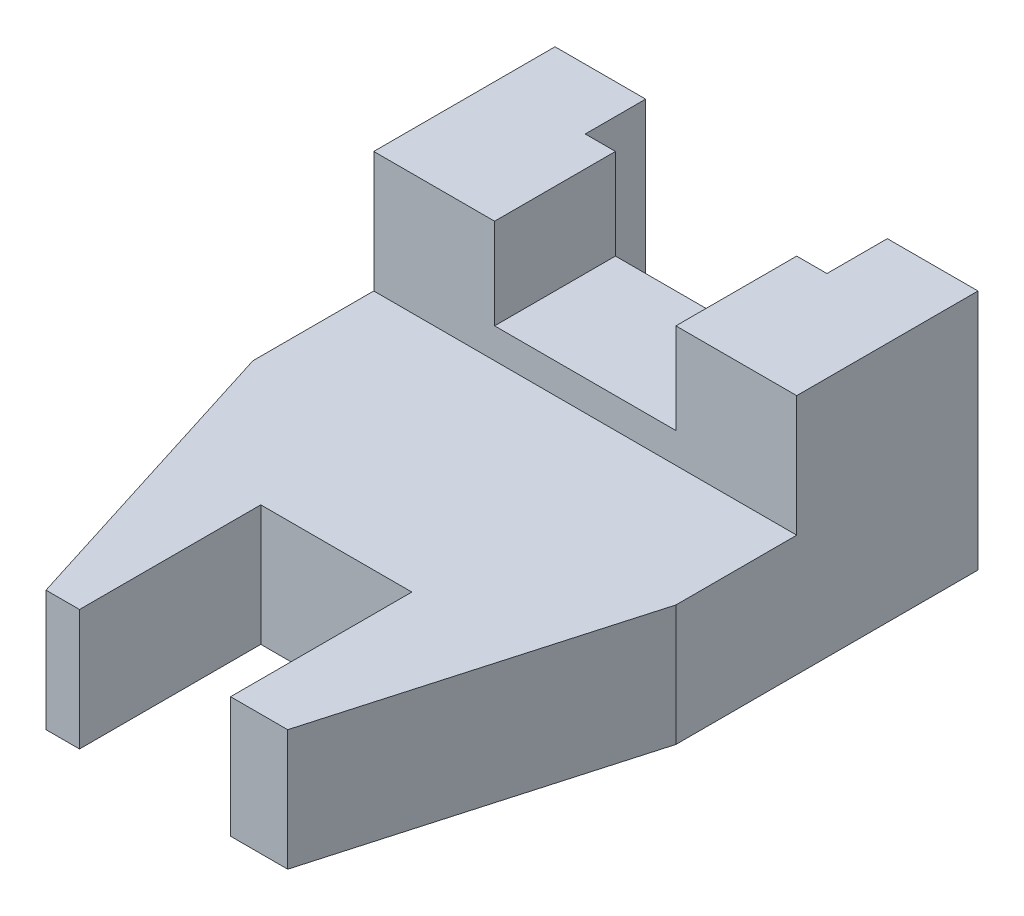
ISO-10303-21;
HEADER;
FILE_DESCRIPTION(('STEP AP214'),'2;1');
FILE_NAME('part.step','',(''),(''),'','','');
FILE_SCHEMA(('AUTOMOTIVE_DESIGN { 1 0 10303 214 1 1 1 1 }'));
ENDSEC;
DATA;
#1=APPLICATION_CONTEXT('core data for automotive mechanical design processes');
#2=APPLICATION_PROTOCOL_DEFINITION('international standard','automotive_design',2000,#1);
#3=PRODUCT_CONTEXT('',#1,'mechanical');
#4=PRODUCT('Part','Part','',(#3));
#5=PRODUCT_RELATED_PRODUCT_CATEGORY('part','',(#4));
#6=PRODUCT_DEFINITION_FORMATION('','',#4);
#7=PRODUCT_DEFINITION_CONTEXT('part definition',#1,'design');
#8=PRODUCT_DEFINITION('design','',#6,#7);
#9=PRODUCT_DEFINITION_SHAPE('','',#8);
#10=(LENGTH_UNIT() NAMED_UNIT(*) SI_UNIT(.MILLI.,.METRE.));
#11=(NAMED_UNIT(*) PLANE_ANGLE_UNIT() SI_UNIT($,.RADIAN.));
#12=(NAMED_UNIT(*) SI_UNIT($,.STERADIAN.) SOLID_ANGLE_UNIT());
#13=UNCERTAINTY_MEASURE_WITH_UNIT(LENGTH_MEASURE(1.E-05),#10,'distance_accuracy_value','');
#14=(GEOMETRIC_REPRESENTATION_CONTEXT(3) GLOBAL_UNCERTAINTY_ASSIGNED_CONTEXT((#13)) GLOBAL_UNIT_ASSIGNED_CONTEXT((#10,
#11,#12)) REPRESENTATION_CONTEXT('',''));
#15=CARTESIAN_POINT('',(0.,0.,0.));
#16=DIRECTION('',(0.,0.,1.));
#17=DIRECTION('',(1.,0.,0.));
#18=AXIS2_PLACEMENT_3D('',#15,#16,#17);
#19=CARTESIAN_POINT('',(0.,20.,0.));
#20=DIRECTION('',(0.,1.,0.));
#21=DIRECTION('',(0.,0.,1.));
#22=AXIS2_PLACEMENT_3D('',#19,#20,#21);
#23=PLANE('',#22);
#24=DIRECTION('',(0.,0.,-1.));
#25=VECTOR('',#24,1.);
#26=CARTESIAN_POINT('',(54.2424242424242,20.,-50.));
#27=LINE('',#26,#25);
#28=CARTESIAN_POINT('',(54.2424242424242,20.,-50.));
#29=VERTEX_POINT('',#28);
#30=CARTESIAN_POINT('',(54.2424242424242,20.,-70.));
#31=VERTEX_POINT('',#30);
#32=EDGE_CURVE('E288',#29,#31,#27,.T.);
#33=ORIENTED_EDGE('',*,*,#32,.T.);
#34=DIRECTION('',(-1.,0.,0.));
#35=VECTOR('',#34,1.);
#36=CARTESIAN_POINT('',(0.,20.,-70.));
#37=LINE('',#36,#35);
#38=CARTESIAN_POINT('',(-15.7575757575758,20.,-70.));
#39=VERTEX_POINT('',#38);
#40=EDGE_CURVE('E261',#31,#39,#37,.T.);
#41=ORIENTED_EDGE('',*,*,#40,.T.);
#42=DIRECTION('',(0.,0.,1.));
#43=VECTOR('',#42,1.);
#44=CARTESIAN_POINT('',(-15.7575757575758,20.,-100.));
#45=LINE('',#44,#43);
#46=CARTESIAN_POINT('',(-15.7575757575758,20.,-50.));
#47=VERTEX_POINT('',#46);
#48=EDGE_CURVE('E292',#39,#47,#45,.T.);
#49=ORIENTED_EDGE('',*,*,#48,.T.);
#50=DIRECTION('',(0.300578034682082,0.,0.953757225433526));
#51=VECTOR('',#50,1.);
#52=CARTESIAN_POINT('',(-15.7575757575758,20.,-50.));
#53=LINE('',#52,#51);
#54=CARTESIAN_POINT('',(0.,20.,0.));
#55=VERTEX_POINT('',#54);
#56=EDGE_CURVE('E265',#47,#55,#53,.T.);
#57=ORIENTED_EDGE('',*,*,#56,.T.);
#58=DIRECTION('',(1.,0.,0.));
#59=VECTOR('',#58,1.);
#60=CARTESIAN_POINT('',(0.,20.,0.));
#61=LINE('',#60,#59);
#62=CARTESIAN_POINT('',(5.54545454545453,20.,0.));
#63=VERTEX_POINT('',#62);
#64=EDGE_CURVE('E269',#55,#63,#61,.T.);
#65=ORIENTED_EDGE('',*,*,#64,.T.);
#66=DIRECTION('',(0.,0.,-1.));
#67=VECTOR('',#66,1.);
#68=CARTESIAN_POINT('',(5.54545454545453,20.,0.));
#69=LINE('',#68,#67);
#70=CARTESIAN_POINT('',(5.54545454545453,20.,-30.));
#71=VERTEX_POINT('',#70);
#72=EDGE_CURVE('E273',#63,#71,#69,.T.);
#73=ORIENTED_EDGE('',*,*,#72,.T.);
#74=DIRECTION('',(1.,0.,0.));
#75=VECTOR('',#74,1.);
#76=CARTESIAN_POINT('',(5.54545454545453,20.,-30.));
#77=LINE('',#76,#75);
#78=CARTESIAN_POINT('',(30.5454545454545,20.,-30.));
#79=VERTEX_POINT('',#78);
#80=EDGE_CURVE('E276',#71,#79,#77,.T.);
#81=ORIENTED_EDGE('',*,*,#80,.T.);
#82=DIRECTION('',(0.,0.,1.));
#83=VECTOR('',#82,1.);
#84=CARTESIAN_POINT('',(30.5454545454545,20.,-30.));
#85=LINE('',#84,#83);
#86=CARTESIAN_POINT('',(30.5454545454545,20.,0.));
#87=VERTEX_POINT('',#86);
#88=EDGE_CURVE('E279',#79,#87,#85,.T.);
#89=ORIENTED_EDGE('',*,*,#88,.T.);
#90=DIRECTION('',(1.,0.,0.));
#91=VECTOR('',#90,1.);
#92=CARTESIAN_POINT('',(30.5454545454545,20.,0.));
#93=LINE('',#92,#91);
#94=CARTESIAN_POINT('',(40.,20.,0.));
#95=VERTEX_POINT('',#94);
#96=EDGE_CURVE('E282',#87,#95,#93,.T.);
#97=ORIENTED_EDGE('',*,*,#96,.T.);
#98=DIRECTION('',(0.273951205066441,0.,-0.961743592254529));
#99=VECTOR('',#98,1.);
#100=CARTESIAN_POINT('',(40.,20.,0.));
#101=LINE('',#100,#99);
#102=EDGE_CURVE('E285',#95,#29,#101,.T.);
#103=ORIENTED_EDGE('',*,*,#102,.T.);
#104=EDGE_LOOP('',(#33,#41,#49,#57,#65,#73,#81,#89,#97,#103));
#105=FACE_BOUND('',#104,.T.);
#106=ADVANCED_FACE('F43',(#105),#23,.T.);
#107=CARTESIAN_POINT('',(34.2424242424242,20.,-90.));
#108=DIRECTION('',(1.,0.,0.));
#109=DIRECTION('',(0.,0.,-1.));
#110=AXIS2_PLACEMENT_3D('',#107,#108,#109);
#111=PLANE('',#110);
#112=DIRECTION('',(0.,-1.,0.));
#113=VECTOR('',#112,1.);
#114=CARTESIAN_POINT('',(34.2424242424242,20.,-90.));
#115=LINE('',#114,#113);
#116=CARTESIAN_POINT('',(34.2424242424242,40.,-90.));
#117=VERTEX_POINT('',#116);
#118=CARTESIAN_POINT('',(34.2424242424242,25.,-90.));
#119=VERTEX_POINT('',#118);
#120=EDGE_CURVE('E59',#117,#119,#115,.T.);
#121=ORIENTED_EDGE('',*,*,#120,.T.);
#122=DIRECTION('',(0.,0.,-1.));
#123=VECTOR('',#122,1.);
#124=CARTESIAN_POINT('',(34.2424242424242,25.,-70.));
#125=LINE('',#124,#123);
#126=CARTESIAN_POINT('',(34.2424242424242,25.,-70.));
#127=VERTEX_POINT('',#126);
#128=EDGE_CURVE('E193',#127,#119,#125,.T.);
#129=ORIENTED_EDGE('',*,*,#128,.F.);
#130=DIRECTION('',(0.,1.,0.));
#131=VECTOR('',#130,1.);
#132=CARTESIAN_POINT('',(34.2424242424242,0.,-70.));
#133=LINE('',#132,#131);
#134=CARTESIAN_POINT('',(34.2424242424242,40.,-70.));
#135=VERTEX_POINT('',#134);
#136=EDGE_CURVE('E182',#127,#135,#133,.T.);
#137=ORIENTED_EDGE('',*,*,#136,.T.);
#138=DIRECTION('',(0.,0.,1.));
#139=VECTOR('',#138,1.);
#140=CARTESIAN_POINT('',(34.2424242424242,40.,-90.));
#141=LINE('',#140,#139);
#142=EDGE_CURVE('E209',#117,#135,#141,.T.);
#143=ORIENTED_EDGE('',*,*,#142,.F.);
#144=EDGE_LOOP('',(#121,#129,#137,#143));
#145=FACE_BOUND('',#144,.T.);
#146=ADVANCED_FACE('F194',(#145),#111,.F.);
#147=CARTESIAN_POINT('',(4.24242424242419,20.,-70.));
#148=DIRECTION('',(-1.,0.,0.));
#149=DIRECTION('',(0.,0.,1.));
#150=AXIS2_PLACEMENT_3D('',#147,#148,#149);
#151=PLANE('',#150);
#152=DIRECTION('',(0.,1.,0.));
#153=VECTOR('',#152,1.);
#154=CARTESIAN_POINT('',(4.24242424242419,0.,-70.));
#155=LINE('',#154,#153);
#156=CARTESIAN_POINT('',(4.24242424242419,25.,-70.));
#157=VERTEX_POINT('',#156);
#158=CARTESIAN_POINT('',(4.24242424242419,40.,-70.));
#159=VERTEX_POINT('',#158);
#160=EDGE_CURVE('E255',#157,#159,#155,.T.);
#161=ORIENTED_EDGE('',*,*,#160,.F.);
#162=DIRECTION('',(0.,0.,1.));
#163=VECTOR('',#162,1.);
#164=CARTESIAN_POINT('',(4.24242424242419,25.,-90.));
#165=LINE('',#164,#163);
#166=CARTESIAN_POINT('',(4.24242424242419,25.,-90.));
#167=VERTEX_POINT('',#166);
#168=EDGE_CURVE('E67',#167,#157,#165,.T.);
#169=ORIENTED_EDGE('',*,*,#168,.F.);
#170=DIRECTION('',(0.,-1.,0.));
#171=VECTOR('',#170,1.);
#172=CARTESIAN_POINT('',(4.24242424242419,20.,-90.));
#173=LINE('',#172,#171);
#174=CARTESIAN_POINT('',(4.24242424242419,40.,-90.));
#175=VERTEX_POINT('',#174);
#176=EDGE_CURVE('E353',#175,#167,#173,.T.);
#177=ORIENTED_EDGE('',*,*,#176,.F.);
#178=DIRECTION('',(0.,0.,1.));
#179=VECTOR('',#178,1.);
#180=CARTESIAN_POINT('',(4.24242424242419,40.,-90.));
#181=LINE('',#180,#179);
#182=EDGE_CURVE('E251',#175,#159,#181,.T.);
#183=ORIENTED_EDGE('',*,*,#182,.T.);
#184=EDGE_LOOP('',(#161,#169,#177,#183));
#185=FACE_BOUND('',#184,.T.);
#186=ADVANCED_FACE('F477',(#185),#151,.F.);
#187=CARTESIAN_POINT('',(-15.7575757575758,20.,-50.));
#188=DIRECTION('',(0.953757225433526,0.,-0.300578034682082));
#189=DIRECTION('',(-0.300578034682082,0.,-0.953757225433526));
#190=AXIS2_PLACEMENT_3D('',#187,#188,#189);
#191=PLANE('',#190);
#192=DIRECTION('',(0.300578034682082,0.,0.953757225433526));
#193=VECTOR('',#192,1.);
#194=CARTESIAN_POINT('',(-15.7575757575758,0.,-50.));
#195=LINE('',#194,#193);
#196=CARTESIAN_POINT('',(-15.7575757575758,0.,-50.));
#197=VERTEX_POINT('',#196);
#198=CARTESIAN_POINT('',(0.,0.,0.));
#199=VERTEX_POINT('',#198);
#200=EDGE_CURVE('E264',#197,#199,#195,.T.);
#201=ORIENTED_EDGE('',*,*,#200,.T.);
#202=DIRECTION('',(0.,-1.,0.));
#203=VECTOR('',#202,1.);
#204=CARTESIAN_POINT('',(0.,20.,0.));
#205=LINE('',#204,#203);
#206=EDGE_CURVE('E11',#55,#199,#205,.T.);
#207=ORIENTED_EDGE('',*,*,#206,.F.);
#208=ORIENTED_EDGE('',*,*,#56,.F.);
#209=DIRECTION('',(0.,-1.,0.));
#210=VECTOR('',#209,1.);
#211=CARTESIAN_POINT('',(-15.7575757575758,20.,-50.));
#212=LINE('',#211,#210);
#213=EDGE_CURVE('E295',#47,#197,#212,.T.);
#214=ORIENTED_EDGE('',*,*,#213,.T.);
#215=EDGE_LOOP('',(#201,#207,#208,#214));
#216=FACE_BOUND('',#215,.T.);
#217=ADVANCED_FACE('F45',(#216),#191,.F.);
#218=CARTESIAN_POINT('',(0.,20.,0.));
#219=DIRECTION('',(0.,0.,-1.));
#220=DIRECTION('',(-1.,0.,0.));
#221=AXIS2_PLACEMENT_3D('',#218,#219,#220);
#222=PLANE('',#221);
#223=DIRECTION('',(1.,0.,0.));
#224=VECTOR('',#223,1.);
#225=CARTESIAN_POINT('',(0.,0.,0.));
#226=LINE('',#225,#224);
#227=CARTESIAN_POINT('',(5.54545454545453,0.,0.));
#228=VERTEX_POINT('',#227);
#229=EDGE_CURVE('E299',#199,#228,#226,.T.);
#230=ORIENTED_EDGE('',*,*,#229,.T.);
#231=DIRECTION('',(0.,-1.,0.));
#232=VECTOR('',#231,1.);
#233=CARTESIAN_POINT('',(5.54545454545453,20.,0.));
#234=LINE('',#233,#232);
#235=EDGE_CURVE('E52',#63,#228,#234,.T.);
#236=ORIENTED_EDGE('',*,*,#235,.F.);
#237=ORIENTED_EDGE('',*,*,#64,.F.);
#238=ORIENTED_EDGE('',*,*,#206,.T.);
#239=EDGE_LOOP('',(#230,#236,#237,#238));
#240=FACE_BOUND('',#239,.T.);
#241=ADVANCED_FACE('F417',(#240),#222,.F.);
#242=CARTESIAN_POINT('',(5.54545454545453,20.,0.));
#243=DIRECTION('',(-1.,0.,0.));
#244=DIRECTION('',(0.,0.,1.));
#245=AXIS2_PLACEMENT_3D('',#242,#243,#244);
#246=PLANE('',#245);
#247=DIRECTION('',(0.,0.,-1.));
#248=VECTOR('',#247,1.);
#249=CARTESIAN_POINT('',(5.54545454545453,0.,0.));
#250=LINE('',#249,#248);
#251=CARTESIAN_POINT('',(5.54545454545453,0.,-30.));
#252=VERTEX_POINT('',#251);
#253=EDGE_CURVE('E302',#228,#252,#250,.T.);
#254=ORIENTED_EDGE('',*,*,#253,.T.);
#255=DIRECTION('',(0.,-1.,0.));
#256=VECTOR('',#255,1.);
#257=CARTESIAN_POINT('',(5.54545454545453,20.,-30.));
#258=LINE('',#257,#256);
#259=EDGE_CURVE('E386',#71,#252,#258,.T.);
#260=ORIENTED_EDGE('',*,*,#259,.F.);
#261=ORIENTED_EDGE('',*,*,#72,.F.);
#262=ORIENTED_EDGE('',*,*,#235,.T.);
#263=EDGE_LOOP('',(#254,#260,#261,#262));
#264=FACE_BOUND('',#263,.T.);
#265=ADVANCED_FACE('F395',(#264),#246,.F.);
#266=CARTESIAN_POINT('',(5.54545454545453,20.,-30.));
#267=DIRECTION('',(0.,0.,-1.));
#268=DIRECTION('',(-1.,0.,0.));
#269=AXIS2_PLACEMENT_3D('',#266,#267,#268);
#270=PLANE('',#269);
#271=DIRECTION('',(1.,0.,0.));
#272=VECTOR('',#271,1.);
#273=CARTESIAN_POINT('',(5.54545454545453,0.,-30.));
#274=LINE('',#273,#272);
#275=CARTESIAN_POINT('',(30.5454545454545,0.,-30.));
#276=VERTEX_POINT('',#275);
#277=EDGE_CURVE('E305',#252,#276,#274,.T.);
#278=ORIENTED_EDGE('',*,*,#277,.T.);
#279=DIRECTION('',(0.,-1.,0.));
#280=VECTOR('',#279,1.);
#281=CARTESIAN_POINT('',(30.5454545454545,20.,-30.));
#282=LINE('',#281,#280);
#283=EDGE_CURVE('E382',#79,#276,#282,.T.);
#284=ORIENTED_EDGE('',*,*,#283,.F.);
#285=ORIENTED_EDGE('',*,*,#80,.F.);
#286=ORIENTED_EDGE('',*,*,#259,.T.);
#287=EDGE_LOOP('',(#278,#284,#285,#286));
#288=FACE_BOUND('',#287,.T.);
#289=ADVANCED_FACE('F406',(#288),#270,.F.);
#290=CARTESIAN_POINT('',(30.5454545454545,20.,-30.));
#291=DIRECTION('',(1.,0.,0.));
#292=DIRECTION('',(0.,0.,-1.));
#293=AXIS2_PLACEMENT_3D('',#290,#291,#292);
#294=PLANE('',#293);
#295=DIRECTION('',(0.,0.,1.));
#296=VECTOR('',#295,1.);
#297=CARTESIAN_POINT('',(30.5454545454545,0.,-30.));
#298=LINE('',#297,#296);
#299=CARTESIAN_POINT('',(30.5454545454545,0.,0.));
#300=VERTEX_POINT('',#299);
#301=EDGE_CURVE('E308',#276,#300,#298,.T.);
#302=ORIENTED_EDGE('',*,*,#301,.T.);
#303=DIRECTION('',(0.,-1.,0.));
#304=VECTOR('',#303,1.);
#305=CARTESIAN_POINT('',(30.5454545454545,20.,0.));
#306=LINE('',#305,#304);
#307=EDGE_CURVE('E378',#87,#300,#306,.T.);
#308=ORIENTED_EDGE('',*,*,#307,.F.);
#309=ORIENTED_EDGE('',*,*,#88,.F.);
#310=ORIENTED_EDGE('',*,*,#283,.T.);
#311=EDGE_LOOP('',(#302,#308,#309,#310));
#312=FACE_BOUND('',#311,.T.);
#313=ADVANCED_FACE('F410',(#312),#294,.F.);
#314=CARTESIAN_POINT('',(30.5454545454545,20.,0.));
#315=DIRECTION('',(0.,0.,-1.));
#316=DIRECTION('',(-1.,0.,0.));
#317=AXIS2_PLACEMENT_3D('',#314,#315,#316);
#318=PLANE('',#317);
#319=DIRECTION('',(1.,0.,0.));
#320=VECTOR('',#319,1.);
#321=CARTESIAN_POINT('',(30.5454545454545,0.,0.));
#322=LINE('',#321,#320);
#323=CARTESIAN_POINT('',(40.,0.,0.));
#324=VERTEX_POINT('',#323);
#325=EDGE_CURVE('E311',#300,#324,#322,.T.);
#326=ORIENTED_EDGE('',*,*,#325,.T.);
#327=DIRECTION('',(0.,-1.,0.));
#328=VECTOR('',#327,1.);
#329=CARTESIAN_POINT('',(40.,20.,0.));
#330=LINE('',#329,#328);
#331=EDGE_CURVE('E374',#95,#324,#330,.T.);
#332=ORIENTED_EDGE('',*,*,#331,.F.);
#333=ORIENTED_EDGE('',*,*,#96,.F.);
#334=ORIENTED_EDGE('',*,*,#307,.T.);
#335=EDGE_LOOP('',(#326,#332,#333,#334));
#336=FACE_BOUND('',#335,.T.);
#337=ADVANCED_FACE('F463',(#336),#318,.F.);
#338=CARTESIAN_POINT('',(40.,20.,0.));
#339=DIRECTION('',(-0.961743592254529,0.,-0.273951205066441));
#340=DIRECTION('',(-0.273951205066441,0.,0.961743592254529));
#341=AXIS2_PLACEMENT_3D('',#338,#339,#340);
#342=PLANE('',#341);
#343=DIRECTION('',(0.273951205066441,0.,-0.961743592254529));
#344=VECTOR('',#343,1.);
#345=CARTESIAN_POINT('',(40.,0.,0.));
#346=LINE('',#345,#344);
#347=CARTESIAN_POINT('',(54.2424242424242,0.,-50.));
#348=VERTEX_POINT('',#347);
#349=EDGE_CURVE('E314',#324,#348,#346,.T.);
#350=ORIENTED_EDGE('',*,*,#349,.T.);
#351=DIRECTION('',(0.,-1.,0.));
#352=VECTOR('',#351,1.);
#353=CARTESIAN_POINT('',(54.2424242424242,20.,-50.));
#354=LINE('',#353,#352);
#355=EDGE_CURVE('E370',#29,#348,#354,.T.);
#356=ORIENTED_EDGE('',*,*,#355,.F.);
#357=ORIENTED_EDGE('',*,*,#102,.F.);
#358=ORIENTED_EDGE('',*,*,#331,.T.);
#359=EDGE_LOOP('',(#350,#356,#357,#358));
#360=FACE_BOUND('',#359,.T.);
#361=ADVANCED_FACE('F461',(#360),#342,.F.);
#362=CARTESIAN_POINT('',(54.2424242424242,20.,-50.));
#363=DIRECTION('',(-1.,0.,0.));
#364=DIRECTION('',(0.,0.,1.));
#365=AXIS2_PLACEMENT_3D('',#362,#363,#364);
#366=PLANE('',#365);
#367=DIRECTION('',(0.,0.,-1.));
#368=VECTOR('',#367,1.);
#369=CARTESIAN_POINT('',(54.2424242424242,0.,-50.));
#370=LINE('',#369,#368);
#371=CARTESIAN_POINT('',(54.2424242424242,0.,-100.));
#372=VERTEX_POINT('',#371);
#373=EDGE_CURVE('E317',#348,#372,#370,.T.);
#374=ORIENTED_EDGE('',*,*,#373,.T.);
#375=DIRECTION('',(0.,-1.,0.));
#376=VECTOR('',#375,1.);
#377=CARTESIAN_POINT('',(54.2424242424242,20.,-100.));
#378=LINE('',#377,#376);
#379=CARTESIAN_POINT('',(54.2424242424242,40.,-100.));
#380=VERTEX_POINT('',#379);
#381=EDGE_CURVE('E366',#380,#372,#378,.T.);
#382=ORIENTED_EDGE('',*,*,#381,.F.);
#383=DIRECTION('',(0.,0.,-1.));
#384=VECTOR('',#383,1.);
#385=CARTESIAN_POINT('',(54.2424242424242,40.,-70.));
#386=LINE('',#385,#384);
#387=CARTESIAN_POINT('',(54.2424242424242,40.,-70.));
#388=VERTEX_POINT('',#387);
#389=EDGE_CURVE('E225',#388,#380,#386,.T.);
#390=ORIENTED_EDGE('',*,*,#389,.F.);
#391=DIRECTION('',(0.,1.,0.));
#392=VECTOR('',#391,1.);
#393=CARTESIAN_POINT('',(54.2424242424242,0.,-70.));
#394=LINE('',#393,#392);
#395=EDGE_CURVE('E190',#31,#388,#394,.T.);
#396=ORIENTED_EDGE('',*,*,#395,.F.);
#397=ORIENTED_EDGE('',*,*,#32,.F.);
#398=ORIENTED_EDGE('',*,*,#355,.T.);
#399=EDGE_LOOP('',(#374,#382,#390,#396,#397,#398));
#400=FACE_BOUND('',#399,.T.);
#401=ADVANCED_FACE('F455',(#400),#366,.F.);
#402=CARTESIAN_POINT('',(54.2424242424242,20.,-100.));
#403=DIRECTION('',(0.,0.,1.));
#404=DIRECTION('',(1.,0.,0.));
#405=AXIS2_PLACEMENT_3D('',#402,#403,#404);
#406=PLANE('',#405);
#407=DIRECTION('',(-1.,0.,0.));
#408=VECTOR('',#407,1.);
#409=CARTESIAN_POINT('',(54.2424242424242,0.,-100.));
#410=LINE('',#409,#408);
#411=CARTESIAN_POINT('',(39.2424242424242,0.,-100.));
#412=VERTEX_POINT('',#411);
#413=EDGE_CURVE('E320',#372,#412,#410,.T.);
#414=ORIENTED_EDGE('',*,*,#413,.T.);
#415=DIRECTION('',(0.,-1.,0.));
#416=VECTOR('',#415,1.);
#417=CARTESIAN_POINT('',(39.2424242424242,20.,-100.));
#418=LINE('',#417,#416);
#419=CARTESIAN_POINT('',(39.2424242424242,40.,-100.));
#420=VERTEX_POINT('',#419);
#421=EDGE_CURVE('E362',#420,#412,#418,.T.);
#422=ORIENTED_EDGE('',*,*,#421,.F.);
#423=DIRECTION('',(-1.,0.,0.));
#424=VECTOR('',#423,1.);
#425=CARTESIAN_POINT('',(54.2424242424242,40.,-100.));
#426=LINE('',#425,#424);
#427=EDGE_CURVE('E221',#380,#420,#426,.T.);
#428=ORIENTED_EDGE('',*,*,#427,.F.);
#429=ORIENTED_EDGE('',*,*,#381,.T.);
#430=EDGE_LOOP('',(#414,#422,#428,#429));
#431=FACE_BOUND('',#430,.T.);
#432=ADVANCED_FACE('F451',(#431),#406,.F.);
#433=CARTESIAN_POINT('',(39.2424242424242,20.,-100.));
#434=DIRECTION('',(1.,0.,0.));
#435=DIRECTION('',(0.,0.,-1.));
#436=AXIS2_PLACEMENT_3D('',#433,#434,#435);
#437=PLANE('',#436);
#438=DIRECTION('',(0.,0.,1.));
#439=VECTOR('',#438,1.);
#440=CARTESIAN_POINT('',(39.2424242424242,0.,-100.));
#441=LINE('',#440,#439);
#442=CARTESIAN_POINT('',(39.2424242424242,0.,-90.));
#443=VERTEX_POINT('',#442);
#444=EDGE_CURVE('E323',#412,#443,#441,.T.);
#445=ORIENTED_EDGE('',*,*,#444,.T.);
#446=DIRECTION('',(0.,-1.,0.));
#447=VECTOR('',#446,1.);
#448=CARTESIAN_POINT('',(39.2424242424242,20.,-90.));
#449=LINE('',#448,#447);
#450=CARTESIAN_POINT('',(39.2424242424242,40.,-90.));
#451=VERTEX_POINT('',#450);
#452=EDGE_CURVE('E358',#451,#443,#449,.T.);
#453=ORIENTED_EDGE('',*,*,#452,.F.);
#454=DIRECTION('',(0.,0.,1.));
#455=VECTOR('',#454,1.);
#456=CARTESIAN_POINT('',(39.2424242424242,40.,-100.));
#457=LINE('',#456,#455);
#458=EDGE_CURVE('E217',#420,#451,#457,.T.);
#459=ORIENTED_EDGE('',*,*,#458,.F.);
#460=ORIENTED_EDGE('',*,*,#421,.T.);
#461=EDGE_LOOP('',(#445,#453,#459,#460));
#462=FACE_BOUND('',#461,.T.);
#463=ADVANCED_FACE('F442',(#462),#437,.F.);
#464=CARTESIAN_POINT('',(4.24242424242419,20.,-90.));
#465=DIRECTION('',(0.,0.,1.));
#466=DIRECTION('',(1.,0.,0.));
#467=AXIS2_PLACEMENT_3D('',#464,#465,#466);
#468=PLANE('',#467);
#469=DIRECTION('',(-1.,0.,0.));
#470=VECTOR('',#469,1.);
#471=CARTESIAN_POINT('',(4.24242424242419,0.,-90.));
#472=LINE('',#471,#470);
#473=CARTESIAN_POINT('',(-0.757575757575811,0.,-90.));
#474=VERTEX_POINT('',#473);
#475=EDGE_CURVE('E327',#443,#474,#472,.T.);
#476=ORIENTED_EDGE('',*,*,#475,.T.);
#477=DIRECTION('',(0.,-1.,0.));
#478=VECTOR('',#477,1.);
#479=CARTESIAN_POINT('',(-0.757575757575811,20.,-90.));
#480=LINE('',#479,#478);
#481=CARTESIAN_POINT('',(-0.757575757575811,40.,-90.));
#482=VERTEX_POINT('',#481);
#483=EDGE_CURVE('E349',#482,#474,#480,.T.);
#484=ORIENTED_EDGE('',*,*,#483,.F.);
#485=DIRECTION('',(1.,0.,0.));
#486=VECTOR('',#485,1.);
#487=CARTESIAN_POINT('',(-0.757575757575811,40.,-90.));
#488=LINE('',#487,#486);
#489=EDGE_CURVE('E247',#482,#175,#488,.T.);
#490=ORIENTED_EDGE('',*,*,#489,.T.);
#491=ORIENTED_EDGE('',*,*,#176,.T.);
#492=DIRECTION('',(-1.,0.,0.));
#493=VECTOR('',#492,1.);
#494=CARTESIAN_POINT('',(34.2424242424242,25.,-90.));
#495=LINE('',#494,#493);
#496=EDGE_CURVE('E191',#119,#167,#495,.T.);
#497=ORIENTED_EDGE('',*,*,#496,.F.);
#498=ORIENTED_EDGE('',*,*,#120,.F.);
#499=DIRECTION('',(-1.,0.,0.));
#500=VECTOR('',#499,1.);
#501=CARTESIAN_POINT('',(39.2424242424242,40.,-90.));
#502=LINE('',#501,#500);
#503=EDGE_CURVE('E213',#451,#117,#502,.T.);
#504=ORIENTED_EDGE('',*,*,#503,.F.);
#505=ORIENTED_EDGE('',*,*,#452,.T.);
#506=EDGE_LOOP('',(#476,#484,#490,#491,#497,#498,#504,#505));
#507=FACE_BOUND('',#506,.T.);
#508=ADVANCED_FACE('F445',(#507),#468,.F.);
#509=CARTESIAN_POINT('',(-0.757575757575811,20.,-90.));
#510=DIRECTION('',(-1.,0.,0.));
#511=DIRECTION('',(0.,0.,1.));
#512=AXIS2_PLACEMENT_3D('',#509,#510,#511);
#513=PLANE('',#512);
#514=DIRECTION('',(0.,0.,-1.));
#515=VECTOR('',#514,1.);
#516=CARTESIAN_POINT('',(-0.757575757575811,0.,-90.));
#517=LINE('',#516,#515);
#518=CARTESIAN_POINT('',(-0.757575757575808,0.,-100.));
#519=VERTEX_POINT('',#518);
#520=EDGE_CURVE('E330',#474,#519,#517,.T.);
#521=ORIENTED_EDGE('',*,*,#520,.T.);
#522=DIRECTION('',(0.,-1.,0.));
#523=VECTOR('',#522,1.);
#524=CARTESIAN_POINT('',(-0.757575757575808,20.,-100.));
#525=LINE('',#524,#523);
#526=CARTESIAN_POINT('',(-0.757575757575808,40.,-100.));
#527=VERTEX_POINT('',#526);
#528=EDGE_CURVE('E345',#527,#519,#525,.T.);
#529=ORIENTED_EDGE('',*,*,#528,.F.);
#530=DIRECTION('',(0.,0.,1.));
#531=VECTOR('',#530,1.);
#532=CARTESIAN_POINT('',(-0.757575757575808,40.,-100.));
#533=LINE('',#532,#531);
#534=EDGE_CURVE('E243',#527,#482,#533,.T.);
#535=ORIENTED_EDGE('',*,*,#534,.T.);
#536=ORIENTED_EDGE('',*,*,#483,.T.);
#537=EDGE_LOOP('',(#521,#529,#535,#536));
#538=FACE_BOUND('',#537,.T.);
#539=ADVANCED_FACE('F437',(#538),#513,.F.);
#540=CARTESIAN_POINT('',(-0.757575757575808,20.,-100.));
#541=DIRECTION('',(0.,0.,1.));
#542=DIRECTION('',(1.,0.,0.));
#543=AXIS2_PLACEMENT_3D('',#540,#541,#542);
#544=PLANE('',#543);
#545=DIRECTION('',(-1.,0.,0.));
#546=VECTOR('',#545,1.);
#547=CARTESIAN_POINT('',(-0.757575757575808,0.,-100.));
#548=LINE('',#547,#546);
#549=CARTESIAN_POINT('',(-15.7575757575758,0.,-100.));
#550=VERTEX_POINT('',#549);
#551=EDGE_CURVE('E333',#519,#550,#548,.T.);
#552=ORIENTED_EDGE('',*,*,#551,.T.);
#553=DIRECTION('',(0.,-1.,0.));
#554=VECTOR('',#553,1.);
#555=CARTESIAN_POINT('',(-15.7575757575758,20.,-100.));
#556=LINE('',#555,#554);
#557=CARTESIAN_POINT('',(-15.7575757575758,40.,-100.));
#558=VERTEX_POINT('',#557);
#559=EDGE_CURVE('E341',#558,#550,#556,.T.);
#560=ORIENTED_EDGE('',*,*,#559,.F.);
#561=DIRECTION('',(1.,0.,0.));
#562=VECTOR('',#561,1.);
#563=CARTESIAN_POINT('',(-15.7575757575758,40.,-100.));
#564=LINE('',#563,#562);
#565=EDGE_CURVE('E239',#558,#527,#564,.T.);
#566=ORIENTED_EDGE('',*,*,#565,.T.);
#567=ORIENTED_EDGE('',*,*,#528,.T.);
#568=EDGE_LOOP('',(#552,#560,#566,#567));
#569=FACE_BOUND('',#568,.T.);
#570=ADVANCED_FACE('F429',(#569),#544,.F.);
#571=CARTESIAN_POINT('',(-15.7575757575758,20.,-100.));
#572=DIRECTION('',(1.,0.,0.));
#573=DIRECTION('',(0.,0.,-1.));
#574=AXIS2_PLACEMENT_3D('',#571,#572,#573);
#575=PLANE('',#574);
#576=DIRECTION('',(0.,0.,1.));
#577=VECTOR('',#576,1.);
#578=CARTESIAN_POINT('',(-15.7575757575758,0.,-100.));
#579=LINE('',#578,#577);
#580=EDGE_CURVE('E270',#550,#197,#579,.T.);
#581=ORIENTED_EDGE('',*,*,#580,.T.);
#582=ORIENTED_EDGE('',*,*,#213,.F.);
#583=ORIENTED_EDGE('',*,*,#48,.F.);
#584=DIRECTION('',(0.,1.,0.));
#585=VECTOR('',#584,1.);
#586=CARTESIAN_POINT('',(-15.7575757575758,0.,-70.));
#587=LINE('',#586,#585);
#588=CARTESIAN_POINT('',(-15.7575757575758,40.,-70.));
#589=VERTEX_POINT('',#588);
#590=EDGE_CURVE('E258',#39,#589,#587,.T.);
#591=ORIENTED_EDGE('',*,*,#590,.T.);
#592=DIRECTION('',(0.,0.,-1.));
#593=VECTOR('',#592,1.);
#594=CARTESIAN_POINT('',(-15.7575757575758,40.,-70.));
#595=LINE('',#594,#593);
#596=EDGE_CURVE('E235',#589,#558,#595,.T.);
#597=ORIENTED_EDGE('',*,*,#596,.T.);
#598=ORIENTED_EDGE('',*,*,#559,.T.);
#599=EDGE_LOOP('',(#581,#582,#583,#591,#597,#598));
#600=FACE_BOUND('',#599,.T.);
#601=ADVANCED_FACE('F424',(#600),#575,.F.);
#602=CARTESIAN_POINT('',(0.,0.,0.));
#603=DIRECTION('',(0.,1.,0.));
#604=DIRECTION('',(0.,0.,1.));
#605=AXIS2_PLACEMENT_3D('',#602,#603,#604);
#606=PLANE('',#605);
#607=ORIENTED_EDGE('',*,*,#475,.F.);
#608=ORIENTED_EDGE('',*,*,#444,.F.);
#609=ORIENTED_EDGE('',*,*,#413,.F.);
#610=ORIENTED_EDGE('',*,*,#373,.F.);
#611=ORIENTED_EDGE('',*,*,#349,.F.);
#612=ORIENTED_EDGE('',*,*,#325,.F.);
#613=ORIENTED_EDGE('',*,*,#301,.F.);
#614=ORIENTED_EDGE('',*,*,#277,.F.);
#615=ORIENTED_EDGE('',*,*,#253,.F.);
#616=ORIENTED_EDGE('',*,*,#229,.F.);
#617=ORIENTED_EDGE('',*,*,#200,.F.);
#618=ORIENTED_EDGE('',*,*,#580,.F.);
#619=ORIENTED_EDGE('',*,*,#551,.F.);
#620=ORIENTED_EDGE('',*,*,#520,.F.);
#621=EDGE_LOOP('',(#607,#608,#609,#610,#611,#612,#613,#614,#615,#616,#617,#618,#619,#620));
#622=FACE_BOUND('',#621,.T.);
#623=ADVANCED_FACE('F400',(#622),#606,.F.);
#624=CARTESIAN_POINT('',(4.24242424242419,0.,-70.));
#625=DIRECTION('',(0.,0.,-1.));
#626=DIRECTION('',(-1.,0.,0.));
#627=AXIS2_PLACEMENT_3D('',#624,#625,#626);
#628=PLANE('',#627);
#629=ORIENTED_EDGE('',*,*,#40,.F.);
#630=ORIENTED_EDGE('',*,*,#395,.T.);
#631=DIRECTION('',(1.,0.,0.));
#632=VECTOR('',#631,1.);
#633=CARTESIAN_POINT('',(34.2424242424242,40.,-70.));
#634=LINE('',#633,#632);
#635=EDGE_CURVE('E187',#135,#388,#634,.T.);
#636=ORIENTED_EDGE('',*,*,#635,.F.);
#637=ORIENTED_EDGE('',*,*,#136,.F.);
#638=DIRECTION('',(1.,0.,0.));
#639=VECTOR('',#638,1.);
#640=CARTESIAN_POINT('',(4.24242424242419,25.,-70.));
#641=LINE('',#640,#639);
#642=EDGE_CURVE('E185',#157,#127,#641,.T.);
#643=ORIENTED_EDGE('',*,*,#642,.F.);
#644=ORIENTED_EDGE('',*,*,#160,.T.);
#645=DIRECTION('',(-1.,0.,0.));
#646=VECTOR('',#645,1.);
#647=CARTESIAN_POINT('',(4.24242424242419,40.,-70.));
#648=LINE('',#647,#646);
#649=EDGE_CURVE('E231',#159,#589,#648,.T.);
#650=ORIENTED_EDGE('',*,*,#649,.T.);
#651=ORIENTED_EDGE('',*,*,#590,.F.);
#652=EDGE_LOOP('',(#629,#630,#636,#637,#643,#644,#650,#651));
#653=FACE_BOUND('',#652,.T.);
#654=ADVANCED_FACE('F183',(#653),#628,.F.);
#655=CARTESIAN_POINT('',(0.,40.,0.));
#656=DIRECTION('',(0.,-1.,0.));
#657=DIRECTION('',(0.,0.,-1.));
#658=AXIS2_PLACEMENT_3D('',#655,#656,#657);
#659=PLANE('',#658);
#660=ORIENTED_EDGE('',*,*,#649,.F.);
#661=ORIENTED_EDGE('',*,*,#182,.F.);
#662=ORIENTED_EDGE('',*,*,#489,.F.);
#663=ORIENTED_EDGE('',*,*,#534,.F.);
#664=ORIENTED_EDGE('',*,*,#565,.F.);
#665=ORIENTED_EDGE('',*,*,#596,.F.);
#666=EDGE_LOOP('',(#660,#661,#662,#663,#664,#665));
#667=FACE_BOUND('',#666,.T.);
#668=ADVANCED_FACE('F433',(#667),#659,.F.);
#669=CARTESIAN_POINT('',(0.,40.,0.));
#670=DIRECTION('',(0.,1.,0.));
#671=DIRECTION('',(0.,0.,1.));
#672=AXIS2_PLACEMENT_3D('',#669,#670,#671);
#673=PLANE('',#672);
#674=ORIENTED_EDGE('',*,*,#635,.T.);
#675=ORIENTED_EDGE('',*,*,#389,.T.);
#676=ORIENTED_EDGE('',*,*,#427,.T.);
#677=ORIENTED_EDGE('',*,*,#458,.T.);
#678=ORIENTED_EDGE('',*,*,#503,.T.);
#679=ORIENTED_EDGE('',*,*,#142,.T.);
#680=EDGE_LOOP('',(#674,#675,#676,#677,#678,#679));
#681=FACE_BOUND('',#680,.T.);
#682=ADVANCED_FACE('F447',(#681),#673,.T.);
#683=CARTESIAN_POINT('',(0.,25.,0.));
#684=DIRECTION('',(0.,1.,0.));
#685=DIRECTION('',(0.,0.,1.));
#686=AXIS2_PLACEMENT_3D('',#683,#684,#685);
#687=PLANE('',#686);
#688=ORIENTED_EDGE('',*,*,#168,.T.);
#689=ORIENTED_EDGE('',*,*,#642,.T.);
#690=ORIENTED_EDGE('',*,*,#128,.T.);
#691=ORIENTED_EDGE('',*,*,#496,.T.);
#692=EDGE_LOOP('',(#688,#689,#690,#691));
#693=FACE_BOUND('',#692,.T.);
#694=ADVANCED_FACE('F200',(#693),#687,.T.);
#695=CLOSED_SHELL('',(#106,#146,#186,#217,#241,#265,#289,#313,#337,#361,#401,#432,#463,#508,
#539,#570,#601,#623,#654,#668,#682,#694));
#696=MANIFOLD_SOLID_BREP('B2',#695);
#697=ADVANCED_BREP_SHAPE_REPRESENTATION('',(#18,#696),#14);
#698=SHAPE_DEFINITION_REPRESENTATION(#9,#697);
ENDSEC;
END-ISO-10303-21;
